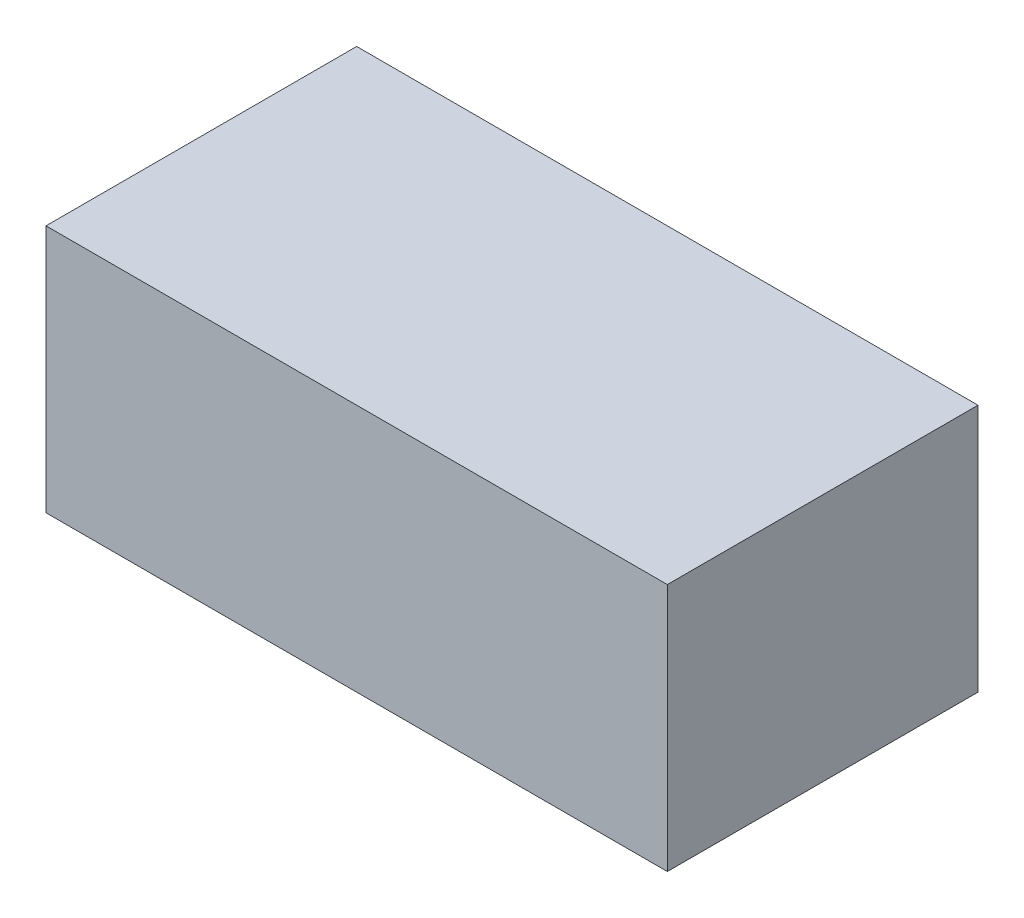
ISO-10303-21;
HEADER;
FILE_DESCRIPTION(('STEP AP214'),'2;1');
FILE_NAME('part.step','',(''),(''),'','','');
FILE_SCHEMA(('AUTOMOTIVE_DESIGN { 1 0 10303 214 1 1 1 1 }'));
ENDSEC;
DATA;
#1=APPLICATION_CONTEXT('core data for automotive mechanical design processes');
#2=APPLICATION_PROTOCOL_DEFINITION('international standard','automotive_design',2000,#1);
#3=PRODUCT_CONTEXT('',#1,'mechanical');
#4=PRODUCT('Part','Part','',(#3));
#5=PRODUCT_RELATED_PRODUCT_CATEGORY('part','',(#4));
#6=PRODUCT_DEFINITION_FORMATION('','',#4);
#7=PRODUCT_DEFINITION_CONTEXT('part definition',#1,'design');
#8=PRODUCT_DEFINITION('design','',#6,#7);
#9=PRODUCT_DEFINITION_SHAPE('','',#8);
#10=(LENGTH_UNIT() NAMED_UNIT(*) SI_UNIT(.MILLI.,.METRE.));
#11=(NAMED_UNIT(*) PLANE_ANGLE_UNIT() SI_UNIT($,.RADIAN.));
#12=(NAMED_UNIT(*) SI_UNIT($,.STERADIAN.) SOLID_ANGLE_UNIT());
#13=UNCERTAINTY_MEASURE_WITH_UNIT(LENGTH_MEASURE(1.E-05),#10,'distance_accuracy_value','');
#14=(GEOMETRIC_REPRESENTATION_CONTEXT(3) GLOBAL_UNCERTAINTY_ASSIGNED_CONTEXT((#13)) GLOBAL_UNIT_ASSIGNED_CONTEXT((#10,
#11,#12)) REPRESENTATION_CONTEXT('',''));
#15=CARTESIAN_POINT('',(0.,0.,0.));
#16=DIRECTION('',(0.,0.,1.));
#17=DIRECTION('',(1.,0.,0.));
#18=AXIS2_PLACEMENT_3D('',#15,#16,#17);
#19=CARTESIAN_POINT('',(0.,0.,15.));
#20=DIRECTION('',(1.,0.,0.));
#21=DIRECTION('',(0.,0.,-1.));
#22=AXIS2_PLACEMENT_3D('',#19,#20,#21);
#23=PLANE('',#22);
#24=DIRECTION('',(0.,-1.,0.));
#25=VECTOR('',#24,1.);
#26=CARTESIAN_POINT('',(0.,0.,0.));
#27=LINE('',#26,#25);
#28=CARTESIAN_POINT('',(0.,12.,0.));
#29=VERTEX_POINT('',#28);
#30=CARTESIAN_POINT('',(0.,0.,0.));
#31=VERTEX_POINT('',#30);
#32=EDGE_CURVE('E75',#29,#31,#27,.T.);
#33=ORIENTED_EDGE('',*,*,#32,.T.);
#34=DIRECTION('',(0.,0.,-1.));
#35=VECTOR('',#34,1.);
#36=CARTESIAN_POINT('',(0.,0.,15.));
#37=LINE('',#36,#35);
#38=CARTESIAN_POINT('',(0.,0.,15.));
#39=VERTEX_POINT('',#38);
#40=EDGE_CURVE('E11',#39,#31,#37,.T.);
#41=ORIENTED_EDGE('',*,*,#40,.F.);
#42=DIRECTION('',(0.,-1.,0.));
#43=VECTOR('',#42,1.);
#44=CARTESIAN_POINT('',(0.,0.,15.));
#45=LINE('',#44,#43);
#46=CARTESIAN_POINT('',(0.,12.,15.));
#47=VERTEX_POINT('',#46);
#48=EDGE_CURVE('E93',#47,#39,#45,.T.);
#49=ORIENTED_EDGE('',*,*,#48,.F.);
#50=DIRECTION('',(0.,0.,-1.));
#51=VECTOR('',#50,1.);
#52=CARTESIAN_POINT('',(0.,12.,15.));
#53=LINE('',#52,#51);
#54=EDGE_CURVE('E87',#47,#29,#53,.T.);
#55=ORIENTED_EDGE('',*,*,#54,.T.);
#56=EDGE_LOOP('',(#33,#41,#49,#55));
#57=FACE_BOUND('',#56,.T.);
#58=ADVANCED_FACE('F31',(#57),#23,.F.);
#59=CARTESIAN_POINT('',(0.,0.,15.));
#60=DIRECTION('',(0.,1.,0.));
#61=DIRECTION('',(0.,0.,1.));
#62=AXIS2_PLACEMENT_3D('',#59,#60,#61);
#63=PLANE('',#62);
#64=DIRECTION('',(1.,0.,0.));
#65=VECTOR('',#64,1.);
#66=CARTESIAN_POINT('',(0.,0.,0.));
#67=LINE('',#66,#65);
#68=CARTESIAN_POINT('',(30.,0.,0.));
#69=VERTEX_POINT('',#68);
#70=EDGE_CURVE('E71',#31,#69,#67,.T.);
#71=ORIENTED_EDGE('',*,*,#70,.T.);
#72=DIRECTION('',(0.,0.,-1.));
#73=VECTOR('',#72,1.);
#74=CARTESIAN_POINT('',(30.,0.,15.));
#75=LINE('',#74,#73);
#76=CARTESIAN_POINT('',(30.,0.,15.));
#77=VERTEX_POINT('',#76);
#78=EDGE_CURVE('E38',#77,#69,#75,.T.);
#79=ORIENTED_EDGE('',*,*,#78,.F.);
#80=DIRECTION('',(1.,0.,0.));
#81=VECTOR('',#80,1.);
#82=CARTESIAN_POINT('',(0.,0.,15.));
#83=LINE('',#82,#81);
#84=EDGE_CURVE('E83',#39,#77,#83,.T.);
#85=ORIENTED_EDGE('',*,*,#84,.F.);
#86=ORIENTED_EDGE('',*,*,#40,.T.);
#87=EDGE_LOOP('',(#71,#79,#85,#86));
#88=FACE_BOUND('',#87,.T.);
#89=ADVANCED_FACE('F82',(#88),#63,.F.);
#90=CARTESIAN_POINT('',(30.,0.,15.));
#91=DIRECTION('',(-1.,0.,0.));
#92=DIRECTION('',(0.,0.,1.));
#93=AXIS2_PLACEMENT_3D('',#90,#91,#92);
#94=PLANE('',#93);
#95=DIRECTION('',(0.,1.,0.));
#96=VECTOR('',#95,1.);
#97=CARTESIAN_POINT('',(30.,0.,0.));
#98=LINE('',#97,#96);
#99=CARTESIAN_POINT('',(30.,12.,0.));
#100=VERTEX_POINT('',#99);
#101=EDGE_CURVE('E76',#69,#100,#98,.T.);
#102=ORIENTED_EDGE('',*,*,#101,.T.);
#103=DIRECTION('',(0.,0.,-1.));
#104=VECTOR('',#103,1.);
#105=CARTESIAN_POINT('',(30.,12.,15.));
#106=LINE('',#105,#104);
#107=CARTESIAN_POINT('',(30.,12.,15.));
#108=VERTEX_POINT('',#107);
#109=EDGE_CURVE('E99',#108,#100,#106,.T.);
#110=ORIENTED_EDGE('',*,*,#109,.F.);
#111=DIRECTION('',(0.,1.,0.));
#112=VECTOR('',#111,1.);
#113=CARTESIAN_POINT('',(30.,0.,15.));
#114=LINE('',#113,#112);
#115=EDGE_CURVE('E50',#77,#108,#114,.T.);
#116=ORIENTED_EDGE('',*,*,#115,.F.);
#117=ORIENTED_EDGE('',*,*,#78,.T.);
#118=EDGE_LOOP('',(#102,#110,#116,#117));
#119=FACE_BOUND('',#118,.T.);
#120=ADVANCED_FACE('F102',(#119),#94,.F.);
#121=CARTESIAN_POINT('',(0.,12.,15.));
#122=DIRECTION('',(0.,-1.,0.));
#123=DIRECTION('',(0.,0.,-1.));
#124=AXIS2_PLACEMENT_3D('',#121,#122,#123);
#125=PLANE('',#124);
#126=DIRECTION('',(-1.,0.,0.));
#127=VECTOR('',#126,1.);
#128=CARTESIAN_POINT('',(0.,12.,0.));
#129=LINE('',#128,#127);
#130=EDGE_CURVE('E91',#100,#29,#129,.T.);
#131=ORIENTED_EDGE('',*,*,#130,.T.);
#132=ORIENTED_EDGE('',*,*,#54,.F.);
#133=DIRECTION('',(-1.,0.,0.));
#134=VECTOR('',#133,1.);
#135=CARTESIAN_POINT('',(0.,12.,15.));
#136=LINE('',#135,#134);
#137=EDGE_CURVE('E45',#108,#47,#136,.T.);
#138=ORIENTED_EDGE('',*,*,#137,.F.);
#139=ORIENTED_EDGE('',*,*,#109,.T.);
#140=EDGE_LOOP('',(#131,#132,#138,#139));
#141=FACE_BOUND('',#140,.T.);
#142=ADVANCED_FACE('F104',(#141),#125,.F.);
#143=CARTESIAN_POINT('',(0.,12.,15.));
#144=DIRECTION('',(0.,0.,-1.));
#145=DIRECTION('',(-1.,0.,0.));
#146=AXIS2_PLACEMENT_3D('',#143,#144,#145);
#147=PLANE('',#146);
#148=ORIENTED_EDGE('',*,*,#48,.T.);
#149=ORIENTED_EDGE('',*,*,#84,.T.);
#150=ORIENTED_EDGE('',*,*,#115,.T.);
#151=ORIENTED_EDGE('',*,*,#137,.T.);
#152=EDGE_LOOP('',(#148,#149,#150,#151));
#153=FACE_BOUND('',#152,.T.);
#154=ADVANCED_FACE('F105',(#153),#147,.F.);
#155=CARTESIAN_POINT('',(0.,12.,0.));
#156=DIRECTION('',(0.,0.,-1.));
#157=DIRECTION('',(-1.,0.,0.));
#158=AXIS2_PLACEMENT_3D('',#155,#156,#157);
#159=PLANE('',#158);
#160=ORIENTED_EDGE('',*,*,#32,.F.);
#161=ORIENTED_EDGE('',*,*,#130,.F.);
#162=ORIENTED_EDGE('',*,*,#101,.F.);
#163=ORIENTED_EDGE('',*,*,#70,.F.);
#164=EDGE_LOOP('',(#160,#161,#162,#163));
#165=FACE_BOUND('',#164,.T.);
#166=ADVANCED_FACE('F72',(#165),#159,.T.);
#167=CLOSED_SHELL('',(#58,#89,#120,#142,#154,#166));
#168=MANIFOLD_SOLID_BREP('B2',#167);
#169=ADVANCED_BREP_SHAPE_REPRESENTATION('',(#18,#168),#14);
#170=SHAPE_DEFINITION_REPRESENTATION(#9,#169);
ENDSEC;
END-ISO-10303-21;
